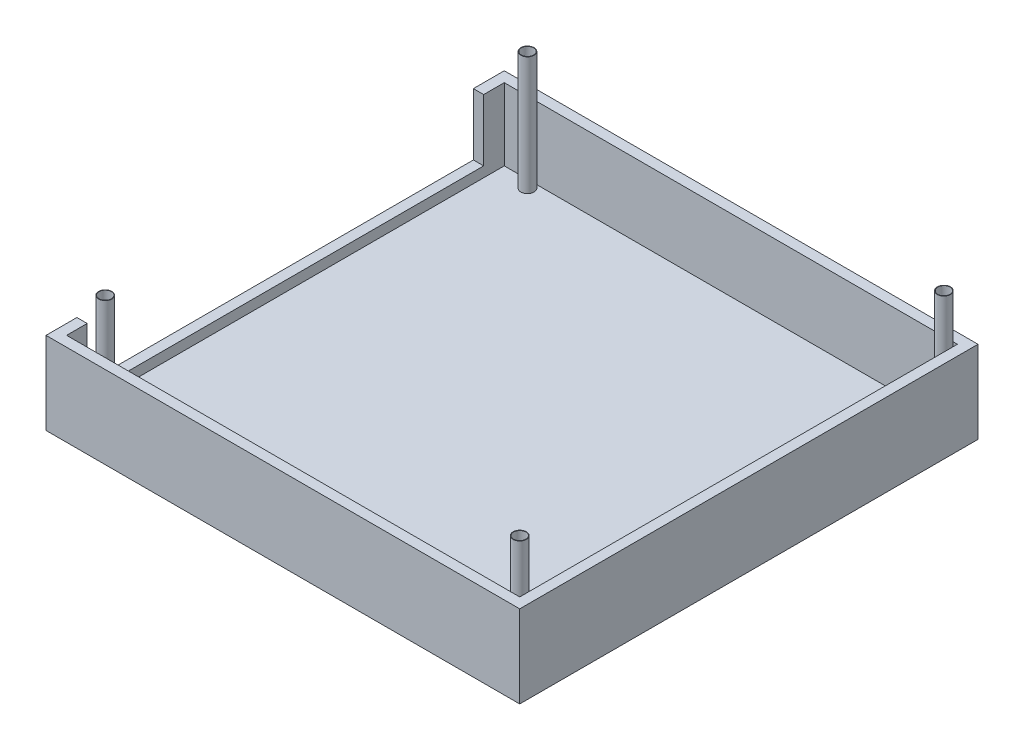
ISO-10303-21;
HEADER;
FILE_DESCRIPTION(('STEP AP214'),'2;1');
FILE_NAME('part.step','',(''),(''),'','','');
FILE_SCHEMA(('AUTOMOTIVE_DESIGN { 1 0 10303 214 1 1 1 1 }'));
ENDSEC;
DATA;
#1=APPLICATION_CONTEXT('core data for automotive mechanical design processes');
#2=APPLICATION_PROTOCOL_DEFINITION('international standard','automotive_design',2000,#1);
#3=PRODUCT_CONTEXT('',#1,'mechanical');
#4=PRODUCT('Part','Part','',(#3));
#5=PRODUCT_RELATED_PRODUCT_CATEGORY('part','',(#4));
#6=PRODUCT_DEFINITION_FORMATION('','',#4);
#7=PRODUCT_DEFINITION_CONTEXT('part definition',#1,'design');
#8=PRODUCT_DEFINITION('design','',#6,#7);
#9=PRODUCT_DEFINITION_SHAPE('','',#8);
#10=(LENGTH_UNIT() NAMED_UNIT(*) SI_UNIT(.MILLI.,.METRE.));
#11=(NAMED_UNIT(*) PLANE_ANGLE_UNIT() SI_UNIT($,.RADIAN.));
#12=(NAMED_UNIT(*) SI_UNIT($,.STERADIAN.) SOLID_ANGLE_UNIT());
#13=UNCERTAINTY_MEASURE_WITH_UNIT(LENGTH_MEASURE(1.E-05),#10,'distance_accuracy_value','');
#14=(GEOMETRIC_REPRESENTATION_CONTEXT(3) GLOBAL_UNCERTAINTY_ASSIGNED_CONTEXT((#13)) GLOBAL_UNIT_ASSIGNED_CONTEXT((#10,
#11,#12)) REPRESENTATION_CONTEXT('',''));
#15=CARTESIAN_POINT('',(0.,0.,0.));
#16=DIRECTION('',(0.,0.,1.));
#17=DIRECTION('',(1.,0.,0.));
#18=AXIS2_PLACEMENT_3D('',#15,#16,#17);
#19=CARTESIAN_POINT('',(-23.,8.,22.25));
#20=DIRECTION('',(-1.,0.,0.));
#21=DIRECTION('',(0.,0.,1.));
#22=AXIS2_PLACEMENT_3D('',#19,#20,#21);
#23=PLANE('',#22);
#24=DIRECTION('',(0.,0.,-1.));
#25=VECTOR('',#24,1.);
#26=CARTESIAN_POINT('',(-23.,2.,-19.25));
#27=LINE('',#26,#25);
#28=CARTESIAN_POINT('',(-23.,2.,19.25));
#29=VERTEX_POINT('',#28);
#30=CARTESIAN_POINT('',(-23.,2.,-19.25));
#31=VERTEX_POINT('',#30);
#32=EDGE_CURVE('E251',#29,#31,#27,.T.);
#33=ORIENTED_EDGE('',*,*,#32,.T.);
#34=DIRECTION('',(0.,1.,0.));
#35=VECTOR('',#34,1.);
#36=CARTESIAN_POINT('',(-23.,8.,-19.25));
#37=LINE('',#36,#35);
#38=CARTESIAN_POINT('',(-23.,8.,-19.25));
#39=VERTEX_POINT('',#38);
#40=EDGE_CURVE('E215',#31,#39,#37,.T.);
#41=ORIENTED_EDGE('',*,*,#40,.T.);
#42=DIRECTION('',(0.,0.,-1.));
#43=VECTOR('',#42,1.);
#44=CARTESIAN_POINT('',(-23.,8.,22.25));
#45=LINE('',#44,#43);
#46=CARTESIAN_POINT('',(-23.,8.,-22.25));
#47=VERTEX_POINT('',#46);
#48=EDGE_CURVE('E81',#39,#47,#45,.T.);
#49=ORIENTED_EDGE('',*,*,#48,.T.);
#50=DIRECTION('',(0.,-1.,0.));
#51=VECTOR('',#50,1.);
#52=CARTESIAN_POINT('',(-23.,8.,-22.25));
#53=LINE('',#52,#51);
#54=CARTESIAN_POINT('',(-23.,0.,-22.25));
#55=VERTEX_POINT('',#54);
#56=EDGE_CURVE('E295',#47,#55,#53,.T.);
#57=ORIENTED_EDGE('',*,*,#56,.T.);
#58=DIRECTION('',(0.,0.,-1.));
#59=VECTOR('',#58,1.);
#60=CARTESIAN_POINT('',(-23.,0.,22.25));
#61=LINE('',#60,#59);
#62=CARTESIAN_POINT('',(-23.,0.,22.25));
#63=VERTEX_POINT('',#62);
#64=EDGE_CURVE('E281',#63,#55,#61,.T.);
#65=ORIENTED_EDGE('',*,*,#64,.F.);
#66=DIRECTION('',(0.,-1.,0.));
#67=VECTOR('',#66,1.);
#68=CARTESIAN_POINT('',(-23.,8.,22.25));
#69=LINE('',#68,#67);
#70=CARTESIAN_POINT('',(-23.,8.,22.25));
#71=VERTEX_POINT('',#70);
#72=EDGE_CURVE('E56',#71,#63,#69,.T.);
#73=ORIENTED_EDGE('',*,*,#72,.F.);
#74=CARTESIAN_POINT('',(-23.,8.,19.25));
#75=VERTEX_POINT('',#74);
#76=EDGE_CURVE('E282',#71,#75,#45,.T.);
#77=ORIENTED_EDGE('',*,*,#76,.T.);
#78=DIRECTION('',(0.,-1.,0.));
#79=VECTOR('',#78,1.);
#80=CARTESIAN_POINT('',(-23.,8.,19.25));
#81=LINE('',#80,#79);
#82=EDGE_CURVE('E262',#75,#29,#81,.T.);
#83=ORIENTED_EDGE('',*,*,#82,.T.);
#84=EDGE_LOOP('',(#33,#41,#49,#57,#65,#73,#77,#83));
#85=FACE_BOUND('',#84,.T.);
#86=ADVANCED_FACE('F39',(#85),#23,.T.);
#87=CARTESIAN_POINT('',(0.,8.,0.));
#88=DIRECTION('',(0.,-1.,0.));
#89=DIRECTION('',(0.,0.,-1.));
#90=AXIS2_PLACEMENT_3D('',#87,#88,#89);
#91=PLANE('',#90);
#92=DIRECTION('',(-1.,0.,0.));
#93=VECTOR('',#92,1.);
#94=CARTESIAN_POINT('',(-22.,8.,-19.25));
#95=LINE('',#94,#93);
#96=CARTESIAN_POINT('',(-22.,8.,-19.25));
#97=VERTEX_POINT('',#96);
#98=EDGE_CURVE('E278',#97,#39,#95,.T.);
#99=ORIENTED_EDGE('',*,*,#98,.F.);
#100=DIRECTION('',(0.,0.,-1.));
#101=VECTOR('',#100,1.);
#102=CARTESIAN_POINT('',(-22.,8.,0.));
#103=LINE('',#102,#101);
#104=CARTESIAN_POINT('',(-22.,8.,-21.25));
#105=VERTEX_POINT('',#104);
#106=EDGE_CURVE('E220',#97,#105,#103,.T.);
#107=ORIENTED_EDGE('',*,*,#106,.T.);
#108=DIRECTION('',(1.,0.,0.));
#109=VECTOR('',#108,1.);
#110=CARTESIAN_POINT('',(0.,8.,-21.25));
#111=LINE('',#110,#109);
#112=CARTESIAN_POINT('',(22.,8.,-21.25));
#113=VERTEX_POINT('',#112);
#114=EDGE_CURVE('E237',#105,#113,#111,.T.);
#115=ORIENTED_EDGE('',*,*,#114,.T.);
#116=DIRECTION('',(0.,0.,-1.));
#117=VECTOR('',#116,1.);
#118=CARTESIAN_POINT('',(22.,8.,0.));
#119=LINE('',#118,#117);
#120=CARTESIAN_POINT('',(22.,8.,21.25));
#121=VERTEX_POINT('',#120);
#122=EDGE_CURVE('E240',#121,#113,#119,.T.);
#123=ORIENTED_EDGE('',*,*,#122,.F.);
#124=DIRECTION('',(1.,0.,0.));
#125=VECTOR('',#124,1.);
#126=CARTESIAN_POINT('',(0.,8.,21.25));
#127=LINE('',#126,#125);
#128=CARTESIAN_POINT('',(-22.,8.,21.25));
#129=VERTEX_POINT('',#128);
#130=EDGE_CURVE('E206',#129,#121,#127,.T.);
#131=ORIENTED_EDGE('',*,*,#130,.F.);
#132=CARTESIAN_POINT('',(-22.,8.,19.25));
#133=VERTEX_POINT('',#132);
#134=EDGE_CURVE('E233',#129,#133,#103,.T.);
#135=ORIENTED_EDGE('',*,*,#134,.T.);
#136=DIRECTION('',(-1.,0.,0.));
#137=VECTOR('',#136,1.);
#138=CARTESIAN_POINT('',(-22.,8.,19.25));
#139=LINE('',#138,#137);
#140=EDGE_CURVE('E274',#133,#75,#139,.T.);
#141=ORIENTED_EDGE('',*,*,#140,.T.);
#142=ORIENTED_EDGE('',*,*,#76,.F.);
#143=DIRECTION('',(1.,0.,0.));
#144=VECTOR('',#143,1.);
#145=CARTESIAN_POINT('',(-23.,8.,22.25));
#146=LINE('',#145,#144);
#147=CARTESIAN_POINT('',(23.,8.,22.25));
#148=VERTEX_POINT('',#147);
#149=EDGE_CURVE('E292',#71,#148,#146,.T.);
#150=ORIENTED_EDGE('',*,*,#149,.T.);
#151=DIRECTION('',(0.,0.,-1.));
#152=VECTOR('',#151,1.);
#153=CARTESIAN_POINT('',(23.,8.,22.25));
#154=LINE('',#153,#152);
#155=CARTESIAN_POINT('',(23.,8.,-22.25));
#156=VERTEX_POINT('',#155);
#157=EDGE_CURVE('E289',#148,#156,#154,.T.);
#158=ORIENTED_EDGE('',*,*,#157,.T.);
#159=DIRECTION('',(1.,0.,0.));
#160=VECTOR('',#159,1.);
#161=CARTESIAN_POINT('',(-23.,8.,-22.25));
#162=LINE('',#161,#160);
#163=EDGE_CURVE('E285',#47,#156,#162,.T.);
#164=ORIENTED_EDGE('',*,*,#163,.F.);
#165=ORIENTED_EDGE('',*,*,#48,.F.);
#166=EDGE_LOOP('',(#99,#107,#115,#123,#131,#135,#141,#142,#150,#158,#164,#165));
#167=FACE_BOUND('',#166,.T.);
#168=ADVANCED_FACE('F367',(#167),#91,.F.);
#169=CARTESIAN_POINT('',(-23.,8.,22.25));
#170=DIRECTION('',(0.,0.,-1.));
#171=DIRECTION('',(-1.,0.,0.));
#172=AXIS2_PLACEMENT_3D('',#169,#170,#171);
#173=PLANE('',#172);
#174=DIRECTION('',(1.,0.,0.));
#175=VECTOR('',#174,1.);
#176=CARTESIAN_POINT('',(-23.,0.,22.25));
#177=LINE('',#176,#175);
#178=CARTESIAN_POINT('',(23.,0.,22.25));
#179=VERTEX_POINT('',#178);
#180=EDGE_CURVE('E74',#63,#179,#177,.T.);
#181=ORIENTED_EDGE('',*,*,#180,.T.);
#182=DIRECTION('',(0.,-1.,0.));
#183=VECTOR('',#182,1.);
#184=CARTESIAN_POINT('',(23.,8.,22.25));
#185=LINE('',#184,#183);
#186=EDGE_CURVE('E312',#148,#179,#185,.T.);
#187=ORIENTED_EDGE('',*,*,#186,.F.);
#188=ORIENTED_EDGE('',*,*,#149,.F.);
#189=ORIENTED_EDGE('',*,*,#72,.T.);
#190=EDGE_LOOP('',(#181,#187,#188,#189));
#191=FACE_BOUND('',#190,.T.);
#192=ADVANCED_FACE('F380',(#191),#173,.F.);
#193=CARTESIAN_POINT('',(23.,8.,22.25));
#194=DIRECTION('',(-1.,0.,0.));
#195=DIRECTION('',(0.,0.,1.));
#196=AXIS2_PLACEMENT_3D('',#193,#194,#195);
#197=PLANE('',#196);
#198=DIRECTION('',(0.,0.,-1.));
#199=VECTOR('',#198,1.);
#200=CARTESIAN_POINT('',(23.,0.,22.25));
#201=LINE('',#200,#199);
#202=CARTESIAN_POINT('',(23.,0.,-22.25));
#203=VERTEX_POINT('',#202);
#204=EDGE_CURVE('E303',#179,#203,#201,.T.);
#205=ORIENTED_EDGE('',*,*,#204,.T.);
#206=DIRECTION('',(0.,-1.,0.));
#207=VECTOR('',#206,1.);
#208=CARTESIAN_POINT('',(23.,8.,-22.25));
#209=LINE('',#208,#207);
#210=EDGE_CURVE('E315',#156,#203,#209,.T.);
#211=ORIENTED_EDGE('',*,*,#210,.F.);
#212=ORIENTED_EDGE('',*,*,#157,.F.);
#213=ORIENTED_EDGE('',*,*,#186,.T.);
#214=EDGE_LOOP('',(#205,#211,#212,#213));
#215=FACE_BOUND('',#214,.T.);
#216=ADVANCED_FACE('F379',(#215),#197,.F.);
#217=CARTESIAN_POINT('',(-23.,8.,-22.25));
#218=DIRECTION('',(0.,0.,-1.));
#219=DIRECTION('',(-1.,0.,0.));
#220=AXIS2_PLACEMENT_3D('',#217,#218,#219);
#221=PLANE('',#220);
#222=DIRECTION('',(1.,0.,0.));
#223=VECTOR('',#222,1.);
#224=CARTESIAN_POINT('',(-23.,0.,-22.25));
#225=LINE('',#224,#223);
#226=EDGE_CURVE('E299',#55,#203,#225,.T.);
#227=ORIENTED_EDGE('',*,*,#226,.F.);
#228=ORIENTED_EDGE('',*,*,#56,.F.);
#229=ORIENTED_EDGE('',*,*,#163,.T.);
#230=ORIENTED_EDGE('',*,*,#210,.T.);
#231=EDGE_LOOP('',(#227,#228,#229,#230));
#232=FACE_BOUND('',#231,.T.);
#233=ADVANCED_FACE('F374',(#232),#221,.T.);
#234=CARTESIAN_POINT('',(0.,0.,0.));
#235=DIRECTION('',(0.,-1.,0.));
#236=DIRECTION('',(0.,0.,-1.));
#237=AXIS2_PLACEMENT_3D('',#234,#235,#236);
#238=PLANE('',#237);
#239=ORIENTED_EDGE('',*,*,#64,.T.);
#240=ORIENTED_EDGE('',*,*,#226,.T.);
#241=ORIENTED_EDGE('',*,*,#204,.F.);
#242=ORIENTED_EDGE('',*,*,#180,.F.);
#243=EDGE_LOOP('',(#239,#240,#241,#242));
#244=FACE_BOUND('',#243,.T.);
#245=ADVANCED_FACE('F376',(#244),#238,.T.);
#246=CARTESIAN_POINT('',(-22.,8.,-19.25));
#247=DIRECTION('',(0.,0.,1.));
#248=DIRECTION('',(1.,0.,0.));
#249=AXIS2_PLACEMENT_3D('',#246,#247,#248);
#250=PLANE('',#249);
#251=ORIENTED_EDGE('',*,*,#40,.F.);
#252=DIRECTION('',(-1.,0.,0.));
#253=VECTOR('',#252,1.);
#254=CARTESIAN_POINT('',(-22.,2.,-19.25));
#255=LINE('',#254,#253);
#256=CARTESIAN_POINT('',(-22.,2.,-19.25));
#257=VERTEX_POINT('',#256);
#258=EDGE_CURVE('E259',#257,#31,#255,.T.);
#259=ORIENTED_EDGE('',*,*,#258,.F.);
#260=DIRECTION('',(0.,1.,0.));
#261=VECTOR('',#260,1.);
#262=CARTESIAN_POINT('',(-22.,8.,-19.25));
#263=LINE('',#262,#261);
#264=EDGE_CURVE('E246',#257,#97,#263,.T.);
#265=ORIENTED_EDGE('',*,*,#264,.T.);
#266=ORIENTED_EDGE('',*,*,#98,.T.);
#267=EDGE_LOOP('',(#251,#259,#265,#266));
#268=FACE_BOUND('',#267,.T.);
#269=ADVANCED_FACE('F366',(#268),#250,.T.);
#270=CARTESIAN_POINT('',(-22.,8.,19.25));
#271=DIRECTION('',(0.,0.,-1.));
#272=DIRECTION('',(-1.,0.,0.));
#273=AXIS2_PLACEMENT_3D('',#270,#271,#272);
#274=PLANE('',#273);
#275=ORIENTED_EDGE('',*,*,#82,.F.);
#276=ORIENTED_EDGE('',*,*,#140,.F.);
#277=DIRECTION('',(0.,-1.,0.));
#278=VECTOR('',#277,1.);
#279=CARTESIAN_POINT('',(-22.,8.,19.25));
#280=LINE('',#279,#278);
#281=CARTESIAN_POINT('',(-22.,2.,19.25));
#282=VERTEX_POINT('',#281);
#283=EDGE_CURVE('E250',#133,#282,#280,.T.);
#284=ORIENTED_EDGE('',*,*,#283,.T.);
#285=DIRECTION('',(-1.,0.,0.));
#286=VECTOR('',#285,1.);
#287=CARTESIAN_POINT('',(-22.,2.,19.25));
#288=LINE('',#287,#286);
#289=EDGE_CURVE('E271',#282,#29,#288,.T.);
#290=ORIENTED_EDGE('',*,*,#289,.T.);
#291=EDGE_LOOP('',(#275,#276,#284,#290));
#292=FACE_BOUND('',#291,.T.);
#293=ADVANCED_FACE('F385',(#292),#274,.T.);
#294=CARTESIAN_POINT('',(-22.,2.,-19.25));
#295=DIRECTION('',(0.,1.,0.));
#296=DIRECTION('',(0.,0.,1.));
#297=AXIS2_PLACEMENT_3D('',#294,#295,#296);
#298=PLANE('',#297);
#299=ORIENTED_EDGE('',*,*,#32,.F.);
#300=ORIENTED_EDGE('',*,*,#289,.F.);
#301=DIRECTION('',(0.,0.,-1.));
#302=VECTOR('',#301,1.);
#303=CARTESIAN_POINT('',(-22.,2.,-19.25));
#304=LINE('',#303,#302);
#305=EDGE_CURVE('E255',#282,#257,#304,.T.);
#306=ORIENTED_EDGE('',*,*,#305,.T.);
#307=ORIENTED_EDGE('',*,*,#258,.T.);
#308=EDGE_LOOP('',(#299,#300,#306,#307));
#309=FACE_BOUND('',#308,.T.);
#310=ADVANCED_FACE('F388',(#309),#298,.T.);
#311=CARTESIAN_POINT('',(-22.,8.,22.25));
#312=DIRECTION('',(-1.,0.,0.));
#313=DIRECTION('',(0.,0.,1.));
#314=AXIS2_PLACEMENT_3D('',#311,#312,#313);
#315=PLANE('',#314);
#316=ORIENTED_EDGE('',*,*,#305,.F.);
#317=ORIENTED_EDGE('',*,*,#283,.F.);
#318=ORIENTED_EDGE('',*,*,#134,.F.);
#319=DIRECTION('',(0.,-1.,0.));
#320=VECTOR('',#319,1.);
#321=CARTESIAN_POINT('',(-22.,8.,21.25));
#322=LINE('',#321,#320);
#323=CARTESIAN_POINT('',(-22.,1.,21.25));
#324=VERTEX_POINT('',#323);
#325=EDGE_CURVE('E211',#129,#324,#322,.T.);
#326=ORIENTED_EDGE('',*,*,#325,.T.);
#327=DIRECTION('',(0.,0.,-1.));
#328=VECTOR('',#327,1.);
#329=CARTESIAN_POINT('',(-22.,1.,0.));
#330=LINE('',#329,#328);
#331=CARTESIAN_POINT('',(-22.,1.,-21.25));
#332=VERTEX_POINT('',#331);
#333=EDGE_CURVE('E201',#324,#332,#330,.T.);
#334=ORIENTED_EDGE('',*,*,#333,.T.);
#335=DIRECTION('',(0.,-1.,0.));
#336=VECTOR('',#335,1.);
#337=CARTESIAN_POINT('',(-22.,8.,-21.25));
#338=LINE('',#337,#336);
#339=EDGE_CURVE('E202',#105,#332,#338,.T.);
#340=ORIENTED_EDGE('',*,*,#339,.F.);
#341=ORIENTED_EDGE('',*,*,#106,.F.);
#342=ORIENTED_EDGE('',*,*,#264,.F.);
#343=EDGE_LOOP('',(#316,#317,#318,#326,#334,#340,#341,#342));
#344=FACE_BOUND('',#343,.T.);
#345=ADVANCED_FACE('F347',(#344),#315,.F.);
#346=CARTESIAN_POINT('',(-23.,8.,21.25));
#347=DIRECTION('',(0.,0.,-1.));
#348=DIRECTION('',(-1.,0.,0.));
#349=AXIS2_PLACEMENT_3D('',#346,#347,#348);
#350=PLANE('',#349);
#351=DIRECTION('',(1.,0.,0.));
#352=VECTOR('',#351,1.);
#353=CARTESIAN_POINT('',(0.,1.,21.25));
#354=LINE('',#353,#352);
#355=CARTESIAN_POINT('',(22.,1.,21.25));
#356=VERTEX_POINT('',#355);
#357=EDGE_CURVE('E217',#324,#356,#354,.T.);
#358=ORIENTED_EDGE('',*,*,#357,.F.);
#359=ORIENTED_EDGE('',*,*,#325,.F.);
#360=ORIENTED_EDGE('',*,*,#130,.T.);
#361=DIRECTION('',(0.,-1.,0.));
#362=VECTOR('',#361,1.);
#363=CARTESIAN_POINT('',(22.,8.,21.25));
#364=LINE('',#363,#362);
#365=EDGE_CURVE('E216',#121,#356,#364,.T.);
#366=ORIENTED_EDGE('',*,*,#365,.T.);
#367=EDGE_LOOP('',(#358,#359,#360,#366));
#368=FACE_BOUND('',#367,.T.);
#369=ADVANCED_FACE('F350',(#368),#350,.T.);
#370=CARTESIAN_POINT('',(22.,8.,22.25));
#371=DIRECTION('',(-1.,0.,0.));
#372=DIRECTION('',(0.,0.,1.));
#373=AXIS2_PLACEMENT_3D('',#370,#371,#372);
#374=PLANE('',#373);
#375=DIRECTION('',(0.,0.,-1.));
#376=VECTOR('',#375,1.);
#377=CARTESIAN_POINT('',(22.,1.,0.));
#378=LINE('',#377,#376);
#379=CARTESIAN_POINT('',(22.,1.,-21.25));
#380=VERTEX_POINT('',#379);
#381=EDGE_CURVE('E221',#356,#380,#378,.T.);
#382=ORIENTED_EDGE('',*,*,#381,.F.);
#383=ORIENTED_EDGE('',*,*,#365,.F.);
#384=ORIENTED_EDGE('',*,*,#122,.T.);
#385=DIRECTION('',(0.,-1.,0.));
#386=VECTOR('',#385,1.);
#387=CARTESIAN_POINT('',(22.,8.,-21.25));
#388=LINE('',#387,#386);
#389=EDGE_CURVE('E205',#113,#380,#388,.T.);
#390=ORIENTED_EDGE('',*,*,#389,.T.);
#391=EDGE_LOOP('',(#382,#383,#384,#390));
#392=FACE_BOUND('',#391,.T.);
#393=ADVANCED_FACE('F355',(#392),#374,.T.);
#394=CARTESIAN_POINT('',(-23.,8.,-21.25));
#395=DIRECTION('',(0.,0.,-1.));
#396=DIRECTION('',(-1.,0.,0.));
#397=AXIS2_PLACEMENT_3D('',#394,#395,#396);
#398=PLANE('',#397);
#399=DIRECTION('',(1.,0.,0.));
#400=VECTOR('',#399,1.);
#401=CARTESIAN_POINT('',(0.,1.,-21.25));
#402=LINE('',#401,#400);
#403=EDGE_CURVE('E210',#332,#380,#402,.T.);
#404=ORIENTED_EDGE('',*,*,#403,.T.);
#405=ORIENTED_EDGE('',*,*,#389,.F.);
#406=ORIENTED_EDGE('',*,*,#114,.F.);
#407=ORIENTED_EDGE('',*,*,#339,.T.);
#408=EDGE_LOOP('',(#404,#405,#406,#407));
#409=FACE_BOUND('',#408,.T.);
#410=ADVANCED_FACE('F336',(#409),#398,.F.);
#411=CARTESIAN_POINT('',(0.,1.,0.));
#412=DIRECTION('',(0.,-1.,0.));
#413=DIRECTION('',(0.,0.,-1.));
#414=AXIS2_PLACEMENT_3D('',#411,#412,#413);
#415=PLANE('',#414);
#416=CARTESIAN_POINT('',(-19.,1.,20.5));
#417=DIRECTION('',(0.,-1.,0.));
#418=DIRECTION('',(0.,0.,-1.));
#419=AXIS2_PLACEMENT_3D('',#416,#417,#418);
#420=CIRCLE('',#419,0.644999999999999);
#421=CARTESIAN_POINT('',(-19.,1.,19.855));
#422=VERTEX_POINT('',#421);
#423=EDGE_CURVE('E11',#422,#422,#420,.F.);
#424=ORIENTED_EDGE('',*,*,#423,.F.);
#425=EDGE_LOOP('',(#424));
#426=FACE_BOUND('',#425,.T.);
#427=CARTESIAN_POINT('',(21.34,1.,20.59));
#428=DIRECTION('',(0.,-1.,0.));
#429=DIRECTION('',(0.,0.,-1.));
#430=AXIS2_PLACEMENT_3D('',#427,#428,#429);
#431=CIRCLE('',#430,0.644999999999999);
#432=CARTESIAN_POINT('',(21.34,1.,19.945));
#433=VERTEX_POINT('',#432);
#434=EDGE_CURVE('E48',#433,#433,#431,.F.);
#435=ORIENTED_EDGE('',*,*,#434,.F.);
#436=EDGE_LOOP('',(#435));
#437=FACE_BOUND('',#436,.T.);
#438=CARTESIAN_POINT('',(21.3355538973163,1.,-20.5993317678294));
#439=DIRECTION('',(0.,-1.,0.));
#440=DIRECTION('',(0.,0.,-1.));
#441=AXIS2_PLACEMENT_3D('',#438,#439,#440);
#442=CIRCLE('',#441,0.644999999999999);
#443=CARTESIAN_POINT('',(21.3355538973163,1.,-21.2443317678294));
#444=VERTEX_POINT('',#443);
#445=EDGE_CURVE('E323',#444,#444,#442,.F.);
#446=ORIENTED_EDGE('',*,*,#445,.F.);
#447=EDGE_LOOP('',(#446));
#448=FACE_BOUND('',#447,.T.);
#449=CARTESIAN_POINT('',(-19.,1.,-20.5));
#450=DIRECTION('',(0.,-1.,0.));
#451=DIRECTION('',(0.,0.,-1.));
#452=AXIS2_PLACEMENT_3D('',#449,#450,#451);
#453=CIRCLE('',#452,0.644999999999999);
#454=CARTESIAN_POINT('',(-19.,1.,-21.145));
#455=VERTEX_POINT('',#454);
#456=EDGE_CURVE('E311',#455,#455,#453,.F.);
#457=ORIENTED_EDGE('',*,*,#456,.F.);
#458=EDGE_LOOP('',(#457));
#459=FACE_BOUND('',#458,.T.);
#460=ORIENTED_EDGE('',*,*,#333,.F.);
#461=ORIENTED_EDGE('',*,*,#357,.T.);
#462=ORIENTED_EDGE('',*,*,#381,.T.);
#463=ORIENTED_EDGE('',*,*,#403,.F.);
#464=EDGE_LOOP('',(#460,#461,#462,#463));
#465=FACE_BOUND('',#464,.T.);
#466=ADVANCED_FACE('F332',(#426,#437,#448,#459,#465),#415,.F.);
#467=CARTESIAN_POINT('',(-19.,12.5,-20.5));
#468=DIRECTION('',(0.,-1.,0.));
#469=DIRECTION('',(0.,0.,-1.));
#470=AXIS2_PLACEMENT_3D('',#467,#468,#469);
#471=CYLINDRICAL_SURFACE('',#470,0.644999999999999);
#472=CARTESIAN_POINT('',(-19.,12.5,-20.5));
#473=DIRECTION('',(0.,1.,0.));
#474=DIRECTION('',(0.,0.,1.));
#475=AXIS2_PLACEMENT_3D('',#472,#473,#474);
#476=CIRCLE('',#475,0.644999999999999);
#477=CARTESIAN_POINT('',(-19.,12.5,-19.855));
#478=VERTEX_POINT('',#477);
#479=EDGE_CURVE('E197',#478,#478,#476,.T.);
#480=ORIENTED_EDGE('',*,*,#479,.F.);
#481=EDGE_LOOP('',(#480));
#482=FACE_BOUND('',#481,.T.);
#483=ORIENTED_EDGE('',*,*,#456,.T.);
#484=EDGE_LOOP('',(#483));
#485=FACE_BOUND('',#484,.T.);
#486=ADVANCED_FACE('F335',(#482,#485),#471,.T.);
#487=CARTESIAN_POINT('',(-19.,12.5,-20.5));
#488=DIRECTION('',(0.,1.,0.));
#489=DIRECTION('',(0.,0.,1.));
#490=AXIS2_PLACEMENT_3D('',#487,#488,#489);
#491=PLANE('',#490);
#492=CARTESIAN_POINT('',(-19.,12.5,-20.5));
#493=DIRECTION('',(0.,1.,0.));
#494=DIRECTION('',(0.,0.,1.));
#495=AXIS2_PLACEMENT_3D('',#492,#493,#494);
#496=CIRCLE('',#495,0.599999999999989);
#497=CARTESIAN_POINT('',(-19.,12.5,-19.9));
#498=VERTEX_POINT('',#497);
#499=EDGE_CURVE('E156',#498,#498,#496,.T.);
#500=ORIENTED_EDGE('',*,*,#499,.F.);
#501=EDGE_LOOP('',(#500));
#502=FACE_BOUND('',#501,.T.);
#503=ORIENTED_EDGE('',*,*,#479,.T.);
#504=EDGE_LOOP('',(#503));
#505=FACE_BOUND('',#504,.T.);
#506=ADVANCED_FACE('F487',(#502,#505),#491,.T.);
#507=CARTESIAN_POINT('',(21.3355538973163,12.5,-20.5993317678294));
#508=DIRECTION('',(0.,-1.,0.));
#509=DIRECTION('',(0.,0.,-1.));
#510=AXIS2_PLACEMENT_3D('',#507,#508,#509);
#511=CYLINDRICAL_SURFACE('',#510,0.644999999999999);
#512=CARTESIAN_POINT('',(21.3355538973163,12.5,-20.5993317678294));
#513=DIRECTION('',(0.,1.,0.));
#514=DIRECTION('',(0.,0.,1.));
#515=AXIS2_PLACEMENT_3D('',#512,#513,#514);
#516=CIRCLE('',#515,0.644999999999999);
#517=CARTESIAN_POINT('',(21.3355538973163,12.5,-19.9543317678294));
#518=VERTEX_POINT('',#517);
#519=EDGE_CURVE('E193',#518,#518,#516,.T.);
#520=ORIENTED_EDGE('',*,*,#519,.F.);
#521=EDGE_LOOP('',(#520));
#522=FACE_BOUND('',#521,.T.);
#523=ORIENTED_EDGE('',*,*,#445,.T.);
#524=EDGE_LOOP('',(#523));
#525=FACE_BOUND('',#524,.T.);
#526=ADVANCED_FACE('F495',(#522,#525),#511,.T.);
#527=CARTESIAN_POINT('',(21.3355538973163,12.5,-20.5993317678294));
#528=DIRECTION('',(0.,1.,0.));
#529=DIRECTION('',(0.,0.,1.));
#530=AXIS2_PLACEMENT_3D('',#527,#528,#529);
#531=PLANE('',#530);
#532=CARTESIAN_POINT('',(21.3355538973163,12.5,-20.5993317678294));
#533=DIRECTION('',(0.,1.,0.));
#534=DIRECTION('',(0.,0.,1.));
#535=AXIS2_PLACEMENT_3D('',#532,#533,#534);
#536=CIRCLE('',#535,0.599999999999989);
#537=CARTESIAN_POINT('',(21.3355538973163,12.5,-19.9993317678294));
#538=VERTEX_POINT('',#537);
#539=EDGE_CURVE('E155',#538,#538,#536,.T.);
#540=ORIENTED_EDGE('',*,*,#539,.F.);
#541=EDGE_LOOP('',(#540));
#542=FACE_BOUND('',#541,.T.);
#543=ORIENTED_EDGE('',*,*,#519,.T.);
#544=EDGE_LOOP('',(#543));
#545=FACE_BOUND('',#544,.T.);
#546=ADVANCED_FACE('F500',(#542,#545),#531,.T.);
#547=CARTESIAN_POINT('',(21.34,12.5,20.59));
#548=DIRECTION('',(0.,-1.,0.));
#549=DIRECTION('',(0.,0.,-1.));
#550=AXIS2_PLACEMENT_3D('',#547,#548,#549);
#551=CYLINDRICAL_SURFACE('',#550,0.644999999999999);
#552=CARTESIAN_POINT('',(21.34,12.5,20.59));
#553=DIRECTION('',(0.,1.,0.));
#554=DIRECTION('',(0.,0.,1.));
#555=AXIS2_PLACEMENT_3D('',#552,#553,#554);
#556=CIRCLE('',#555,0.644999999999999);
#557=CARTESIAN_POINT('',(21.34,12.5,21.235));
#558=VERTEX_POINT('',#557);
#559=EDGE_CURVE('E189',#558,#558,#556,.T.);
#560=ORIENTED_EDGE('',*,*,#559,.F.);
#561=EDGE_LOOP('',(#560));
#562=FACE_BOUND('',#561,.T.);
#563=ORIENTED_EDGE('',*,*,#434,.T.);
#564=EDGE_LOOP('',(#563));
#565=FACE_BOUND('',#564,.T.);
#566=ADVANCED_FACE('F330',(#562,#565),#551,.T.);
#567=CARTESIAN_POINT('',(21.34,12.5,20.59));
#568=DIRECTION('',(0.,1.,0.));
#569=DIRECTION('',(0.,0.,1.));
#570=AXIS2_PLACEMENT_3D('',#567,#568,#569);
#571=PLANE('',#570);
#572=CARTESIAN_POINT('',(21.34,12.5,20.59));
#573=DIRECTION('',(0.,1.,0.));
#574=DIRECTION('',(0.,0.,1.));
#575=AXIS2_PLACEMENT_3D('',#572,#573,#574);
#576=CIRCLE('',#575,0.599999999999989);
#577=CARTESIAN_POINT('',(21.34,12.5,21.19));
#578=VERTEX_POINT('',#577);
#579=EDGE_CURVE('E169',#578,#578,#576,.T.);
#580=ORIENTED_EDGE('',*,*,#579,.F.);
#581=EDGE_LOOP('',(#580));
#582=FACE_BOUND('',#581,.T.);
#583=ORIENTED_EDGE('',*,*,#559,.T.);
#584=EDGE_LOOP('',(#583));
#585=FACE_BOUND('',#584,.T.);
#586=ADVANCED_FACE('F512',(#582,#585),#571,.T.);
#587=CARTESIAN_POINT('',(-19.,12.5,20.5));
#588=DIRECTION('',(0.,-1.,0.));
#589=DIRECTION('',(0.,0.,-1.));
#590=AXIS2_PLACEMENT_3D('',#587,#588,#589);
#591=CYLINDRICAL_SURFACE('',#590,0.644999999999999);
#592=CARTESIAN_POINT('',(-19.,12.5,20.5));
#593=DIRECTION('',(0.,1.,0.));
#594=DIRECTION('',(0.,0.,1.));
#595=AXIS2_PLACEMENT_3D('',#592,#593,#594);
#596=CIRCLE('',#595,0.644999999999999);
#597=CARTESIAN_POINT('',(-19.,12.5,21.145));
#598=VERTEX_POINT('',#597);
#599=EDGE_CURVE('E185',#598,#598,#596,.T.);
#600=ORIENTED_EDGE('',*,*,#599,.F.);
#601=EDGE_LOOP('',(#600));
#602=FACE_BOUND('',#601,.T.);
#603=ORIENTED_EDGE('',*,*,#423,.T.);
#604=EDGE_LOOP('',(#603));
#605=FACE_BOUND('',#604,.T.);
#606=ADVANCED_FACE('F520',(#602,#605),#591,.T.);
#607=CARTESIAN_POINT('',(-19.,12.5,20.5));
#608=DIRECTION('',(0.,1.,0.));
#609=DIRECTION('',(0.,0.,1.));
#610=AXIS2_PLACEMENT_3D('',#607,#608,#609);
#611=PLANE('',#610);
#612=CARTESIAN_POINT('',(-19.,12.5,20.5));
#613=DIRECTION('',(0.,1.,0.));
#614=DIRECTION('',(0.,0.,1.));
#615=AXIS2_PLACEMENT_3D('',#612,#613,#614);
#616=CIRCLE('',#615,0.599999999999989);
#617=CARTESIAN_POINT('',(-19.,12.5,21.1));
#618=VERTEX_POINT('',#617);
#619=EDGE_CURVE('E177',#618,#618,#616,.T.);
#620=ORIENTED_EDGE('',*,*,#619,.F.);
#621=EDGE_LOOP('',(#620));
#622=FACE_BOUND('',#621,.T.);
#623=ORIENTED_EDGE('',*,*,#599,.T.);
#624=EDGE_LOOP('',(#623));
#625=FACE_BOUND('',#624,.T.);
#626=ADVANCED_FACE('F525',(#622,#625),#611,.T.);
#627=CARTESIAN_POINT('',(-19.,1.,20.5));
#628=DIRECTION('',(0.,1.,0.));
#629=DIRECTION('',(0.,0.,1.));
#630=AXIS2_PLACEMENT_3D('',#627,#628,#629);
#631=CONICAL_SURFACE('',#630,0.599999999999996,1.02974425867665);
#632=CARTESIAN_POINT('',(-19.,0.639483628583465,20.5));
#633=VERTEX_POINT('',#632);
#634=VERTEX_LOOP('',#633);
#635=FACE_BOUND('',#634,.T.);
#636=CARTESIAN_POINT('',(-19.,1.,20.5));
#637=DIRECTION('',(0.,1.,0.));
#638=DIRECTION('',(0.,0.,1.));
#639=AXIS2_PLACEMENT_3D('',#636,#637,#638);
#640=CIRCLE('',#639,0.599999999999996);
#641=CARTESIAN_POINT('',(-19.,1.,21.1));
#642=VERTEX_POINT('',#641);
#643=EDGE_CURVE('E181',#642,#642,#640,.T.);
#644=ORIENTED_EDGE('',*,*,#643,.T.);
#645=EDGE_LOOP('',(#644));
#646=FACE_BOUND('',#645,.T.);
#647=ADVANCED_FACE('F556',(#635,#646),#631,.F.);
#648=CARTESIAN_POINT('',(-19.,12.5,20.5));
#649=DIRECTION('',(0.,1.,0.));
#650=DIRECTION('',(0.,0.,1.));
#651=AXIS2_PLACEMENT_3D('',#648,#649,#650);
#652=CYLINDRICAL_SURFACE('',#651,0.599999999999993);
#653=ORIENTED_EDGE('',*,*,#643,.F.);
#654=EDGE_LOOP('',(#653));
#655=FACE_BOUND('',#654,.T.);
#656=ORIENTED_EDGE('',*,*,#619,.T.);
#657=EDGE_LOOP('',(#656));
#658=FACE_BOUND('',#657,.T.);
#659=ADVANCED_FACE('F566',(#655,#658),#652,.F.);
#660=CARTESIAN_POINT('',(21.34,1.,20.59));
#661=DIRECTION('',(0.,1.,0.));
#662=DIRECTION('',(0.,0.,1.));
#663=AXIS2_PLACEMENT_3D('',#660,#661,#662);
#664=CONICAL_SURFACE('',#663,0.599999999999996,1.02974425867665);
#665=CARTESIAN_POINT('',(21.34,0.639483628583465,20.59));
#666=VERTEX_POINT('',#665);
#667=VERTEX_LOOP('',#666);
#668=FACE_BOUND('',#667,.T.);
#669=CARTESIAN_POINT('',(21.34,1.,20.59));
#670=DIRECTION('',(0.,1.,0.));
#671=DIRECTION('',(0.,0.,1.));
#672=AXIS2_PLACEMENT_3D('',#669,#670,#671);
#673=CIRCLE('',#672,0.599999999999996);
#674=CARTESIAN_POINT('',(21.34,1.,21.19));
#675=VERTEX_POINT('',#674);
#676=EDGE_CURVE('E173',#675,#675,#673,.T.);
#677=ORIENTED_EDGE('',*,*,#676,.T.);
#678=EDGE_LOOP('',(#677));
#679=FACE_BOUND('',#678,.T.);
#680=ADVANCED_FACE('F576',(#668,#679),#664,.F.);
#681=CARTESIAN_POINT('',(21.34,12.5,20.59));
#682=DIRECTION('',(0.,1.,0.));
#683=DIRECTION('',(0.,0.,1.));
#684=AXIS2_PLACEMENT_3D('',#681,#682,#683);
#685=CYLINDRICAL_SURFACE('',#684,0.599999999999993);
#686=ORIENTED_EDGE('',*,*,#676,.F.);
#687=EDGE_LOOP('',(#686));
#688=FACE_BOUND('',#687,.T.);
#689=ORIENTED_EDGE('',*,*,#579,.T.);
#690=EDGE_LOOP('',(#689));
#691=FACE_BOUND('',#690,.T.);
#692=ADVANCED_FACE('F586',(#688,#691),#685,.F.);
#693=CARTESIAN_POINT('',(21.3355538973163,1.,-20.5993317678294));
#694=DIRECTION('',(0.,1.,0.));
#695=DIRECTION('',(0.,0.,1.));
#696=AXIS2_PLACEMENT_3D('',#693,#694,#695);
#697=CONICAL_SURFACE('',#696,0.599999999999996,1.02974425867665);
#698=CARTESIAN_POINT('',(21.3355538973163,0.639483628583465,-20.5993317678294));
#699=VERTEX_POINT('',#698);
#700=VERTEX_LOOP('',#699);
#701=FACE_BOUND('',#700,.T.);
#702=CARTESIAN_POINT('',(21.3355538973163,1.,-20.5993317678294));
#703=DIRECTION('',(0.,1.,0.));
#704=DIRECTION('',(0.,0.,1.));
#705=AXIS2_PLACEMENT_3D('',#702,#703,#704);
#706=CIRCLE('',#705,0.599999999999996);
#707=CARTESIAN_POINT('',(21.3355538973163,1.,-19.9993317678294));
#708=VERTEX_POINT('',#707);
#709=EDGE_CURVE('E161',#708,#708,#706,.T.);
#710=ORIENTED_EDGE('',*,*,#709,.T.);
#711=EDGE_LOOP('',(#710));
#712=FACE_BOUND('',#711,.T.);
#713=ADVANCED_FACE('F596',(#701,#712),#697,.F.);
#714=CARTESIAN_POINT('',(21.3355538973163,12.5,-20.5993317678294));
#715=DIRECTION('',(0.,1.,0.));
#716=DIRECTION('',(0.,0.,1.));
#717=AXIS2_PLACEMENT_3D('',#714,#715,#716);
#718=CYLINDRICAL_SURFACE('',#717,0.599999999999993);
#719=ORIENTED_EDGE('',*,*,#709,.F.);
#720=EDGE_LOOP('',(#719));
#721=FACE_BOUND('',#720,.T.);
#722=ORIENTED_EDGE('',*,*,#539,.T.);
#723=EDGE_LOOP('',(#722));
#724=FACE_BOUND('',#723,.T.);
#725=ADVANCED_FACE('F148',(#721,#724),#718,.F.);
#726=CARTESIAN_POINT('',(-19.,1.,-20.5));
#727=DIRECTION('',(0.,1.,0.));
#728=DIRECTION('',(0.,0.,1.));
#729=AXIS2_PLACEMENT_3D('',#726,#727,#728);
#730=CONICAL_SURFACE('',#729,0.599999999999996,1.02974425867665);
#731=CARTESIAN_POINT('',(-19.,0.639483628583465,-20.5));
#732=VERTEX_POINT('',#731);
#733=VERTEX_LOOP('',#732);
#734=FACE_BOUND('',#733,.T.);
#735=CARTESIAN_POINT('',(-19.,1.,-20.5));
#736=DIRECTION('',(0.,1.,0.));
#737=DIRECTION('',(0.,0.,1.));
#738=AXIS2_PLACEMENT_3D('',#735,#736,#737);
#739=CIRCLE('',#738,0.599999999999996);
#740=CARTESIAN_POINT('',(-19.,1.,-19.9));
#741=VERTEX_POINT('',#740);
#742=EDGE_CURVE('E152',#741,#741,#739,.T.);
#743=ORIENTED_EDGE('',*,*,#742,.T.);
#744=EDGE_LOOP('',(#743));
#745=FACE_BOUND('',#744,.T.);
#746=ADVANCED_FACE('F144',(#734,#745),#730,.F.);
#747=CARTESIAN_POINT('',(-19.,12.5,-20.5));
#748=DIRECTION('',(0.,1.,0.));
#749=DIRECTION('',(0.,0.,1.));
#750=AXIS2_PLACEMENT_3D('',#747,#748,#749);
#751=CYLINDRICAL_SURFACE('',#750,0.599999999999993);
#752=ORIENTED_EDGE('',*,*,#742,.F.);
#753=EDGE_LOOP('',(#752));
#754=FACE_BOUND('',#753,.T.);
#755=ORIENTED_EDGE('',*,*,#499,.T.);
#756=EDGE_LOOP('',(#755));
#757=FACE_BOUND('',#756,.T.);
#758=ADVANCED_FACE('F147',(#754,#757),#751,.F.);
#759=CLOSED_SHELL('',(#86,#168,#192,#216,#233,#245,#269,#293,#310,#345,#369,#393,#410,#466,#486,
#506,#526,#546,#566,#586,#606,#626,#647,#659,#680,#692,#713,#725,#746,#758));
#760=MANIFOLD_SOLID_BREP('B2',#759);
#761=ADVANCED_BREP_SHAPE_REPRESENTATION('',(#18,#760),#14);
#762=SHAPE_DEFINITION_REPRESENTATION(#9,#761);
ENDSEC;
END-ISO-10303-21;
